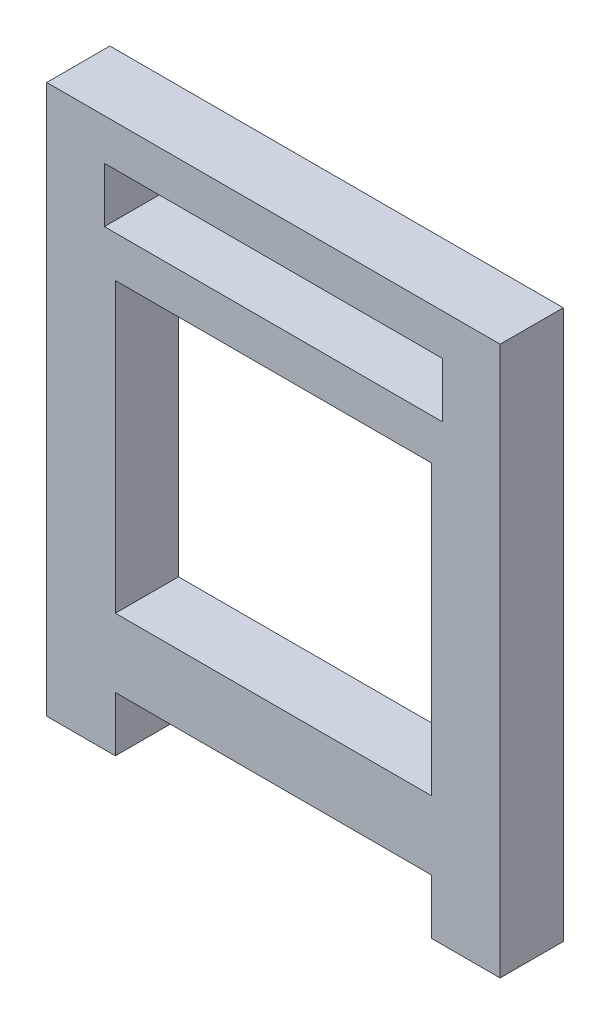
ISO-10303-21;
HEADER;
FILE_DESCRIPTION(('STEP AP214'),'2;1');
FILE_NAME('part.step','',(''),(''),'','','');
FILE_SCHEMA(('AUTOMOTIVE_DESIGN { 1 0 10303 214 1 1 1 1 }'));
ENDSEC;
DATA;
#1=APPLICATION_CONTEXT('core data for automotive mechanical design processes');
#2=APPLICATION_PROTOCOL_DEFINITION('international standard','automotive_design',2000,#1);
#3=PRODUCT_CONTEXT('',#1,'mechanical');
#4=PRODUCT('Part','Part','',(#3));
#5=PRODUCT_RELATED_PRODUCT_CATEGORY('part','',(#4));
#6=PRODUCT_DEFINITION_FORMATION('','',#4);
#7=PRODUCT_DEFINITION_CONTEXT('part definition',#1,'design');
#8=PRODUCT_DEFINITION('design','',#6,#7);
#9=PRODUCT_DEFINITION_SHAPE('','',#8);
#10=(LENGTH_UNIT() NAMED_UNIT(*) SI_UNIT(.MILLI.,.METRE.));
#11=(NAMED_UNIT(*) PLANE_ANGLE_UNIT() SI_UNIT($,.RADIAN.));
#12=(NAMED_UNIT(*) SI_UNIT($,.STERADIAN.) SOLID_ANGLE_UNIT());
#13=UNCERTAINTY_MEASURE_WITH_UNIT(LENGTH_MEASURE(1.E-05),#10,'distance_accuracy_value','');
#14=(GEOMETRIC_REPRESENTATION_CONTEXT(3) GLOBAL_UNCERTAINTY_ASSIGNED_CONTEXT((#13)) GLOBAL_UNIT_ASSIGNED_CONTEXT((#10,
#11,#12)) REPRESENTATION_CONTEXT('',''));
#15=CARTESIAN_POINT('',(0.,0.,0.));
#16=DIRECTION('',(0.,0.,1.));
#17=DIRECTION('',(1.,0.,0.));
#18=AXIS2_PLACEMENT_3D('',#15,#16,#17);
#19=CARTESIAN_POINT('',(0.,0.,2.3));
#20=DIRECTION('',(0.,0.,-1.));
#21=DIRECTION('',(-1.,0.,0.));
#22=AXIS2_PLACEMENT_3D('',#19,#20,#21);
#23=PLANE('',#22);
#24=DIRECTION('',(0.,1.,0.));
#25=VECTOR('',#24,1.);
#26=CARTESIAN_POINT('',(14.02,2.5,2.3));
#27=LINE('',#26,#25);
#28=CARTESIAN_POINT('',(14.02,2.5,2.3));
#29=VERTEX_POINT('',#28);
#30=CARTESIAN_POINT('',(14.02,13.,2.3));
#31=VERTEX_POINT('',#30);
#32=EDGE_CURVE('E188',#29,#31,#27,.T.);
#33=ORIENTED_EDGE('',*,*,#32,.F.);
#34=DIRECTION('',(1.,0.,0.));
#35=VECTOR('',#34,1.);
#36=CARTESIAN_POINT('',(2.5,2.5,2.3));
#37=LINE('',#36,#35);
#38=CARTESIAN_POINT('',(2.5,2.5,2.3));
#39=VERTEX_POINT('',#38);
#40=EDGE_CURVE('E196',#39,#29,#37,.T.);
#41=ORIENTED_EDGE('',*,*,#40,.F.);
#42=DIRECTION('',(0.,-1.,0.));
#43=VECTOR('',#42,1.);
#44=CARTESIAN_POINT('',(2.5,2.5,2.3));
#45=LINE('',#44,#43);
#46=CARTESIAN_POINT('',(2.5,13.,2.3));
#47=VERTEX_POINT('',#46);
#48=EDGE_CURVE('E193',#47,#39,#45,.T.);
#49=ORIENTED_EDGE('',*,*,#48,.F.);
#50=DIRECTION('',(-1.,0.,0.));
#51=VECTOR('',#50,1.);
#52=CARTESIAN_POINT('',(2.5,13.,2.3));
#53=LINE('',#52,#51);
#54=EDGE_CURVE('E190',#31,#47,#53,.T.);
#55=ORIENTED_EDGE('',*,*,#54,.F.);
#56=EDGE_LOOP('',(#33,#41,#49,#55));
#57=FACE_BOUND('',#56,.T.);
#58=DIRECTION('',(0.,-1.,0.));
#59=VECTOR('',#58,1.);
#60=CARTESIAN_POINT('',(0.,0.,2.3));
#61=LINE('',#60,#59);
#62=CARTESIAN_POINT('',(0.,18.,2.3));
#63=VERTEX_POINT('',#62);
#64=CARTESIAN_POINT('',(0.,-2.,2.3));
#65=VERTEX_POINT('',#64);
#66=EDGE_CURVE('E219',#63,#65,#61,.T.);
#67=ORIENTED_EDGE('',*,*,#66,.T.);
#68=DIRECTION('',(1.,0.,0.));
#69=VECTOR('',#68,1.);
#70=CARTESIAN_POINT('',(0.,-2.,2.3));
#71=LINE('',#70,#69);
#72=CARTESIAN_POINT('',(2.5,-2.,2.3));
#73=VERTEX_POINT('',#72);
#74=EDGE_CURVE('E221',#65,#73,#71,.T.);
#75=ORIENTED_EDGE('',*,*,#74,.T.);
#76=DIRECTION('',(0.,1.,0.));
#77=VECTOR('',#76,1.);
#78=CARTESIAN_POINT('',(2.5,-2.,2.3));
#79=LINE('',#78,#77);
#80=CARTESIAN_POINT('',(2.5,0.,2.3));
#81=VERTEX_POINT('',#80);
#82=EDGE_CURVE('E224',#73,#81,#79,.T.);
#83=ORIENTED_EDGE('',*,*,#82,.T.);
#84=DIRECTION('',(1.,0.,0.));
#85=VECTOR('',#84,1.);
#86=CARTESIAN_POINT('',(2.5,0.,2.3));
#87=LINE('',#86,#85);
#88=CARTESIAN_POINT('',(14.02,0.,2.3));
#89=VERTEX_POINT('',#88);
#90=EDGE_CURVE('E226',#81,#89,#87,.T.);
#91=ORIENTED_EDGE('',*,*,#90,.T.);
#92=DIRECTION('',(0.,-1.,0.));
#93=VECTOR('',#92,1.);
#94=CARTESIAN_POINT('',(14.02,-2.,2.3));
#95=LINE('',#94,#93);
#96=CARTESIAN_POINT('',(14.02,-2.,2.3));
#97=VERTEX_POINT('',#96);
#98=EDGE_CURVE('E228',#89,#97,#95,.T.);
#99=ORIENTED_EDGE('',*,*,#98,.T.);
#100=DIRECTION('',(1.,0.,0.));
#101=VECTOR('',#100,1.);
#102=CARTESIAN_POINT('',(16.52,-2.,2.3));
#103=LINE('',#102,#101);
#104=CARTESIAN_POINT('',(16.52,-2.,2.3));
#105=VERTEX_POINT('',#104);
#106=EDGE_CURVE('E230',#97,#105,#103,.T.);
#107=ORIENTED_EDGE('',*,*,#106,.T.);
#108=DIRECTION('',(0.,1.,0.));
#109=VECTOR('',#108,1.);
#110=CARTESIAN_POINT('',(16.52,0.,2.3));
#111=LINE('',#110,#109);
#112=CARTESIAN_POINT('',(16.52,18.,2.3));
#113=VERTEX_POINT('',#112);
#114=EDGE_CURVE('E232',#105,#113,#111,.T.);
#115=ORIENTED_EDGE('',*,*,#114,.T.);
#116=DIRECTION('',(-1.,0.,0.));
#117=VECTOR('',#116,1.);
#118=CARTESIAN_POINT('',(0.,18.,2.3));
#119=LINE('',#118,#117);
#120=EDGE_CURVE('E234',#113,#63,#119,.T.);
#121=ORIENTED_EDGE('',*,*,#120,.T.);
#122=EDGE_LOOP('',(#67,#75,#83,#91,#99,#107,#115,#121));
#123=FACE_BOUND('',#122,.T.);
#124=DIRECTION('',(0.,-1.,0.));
#125=VECTOR('',#124,1.);
#126=CARTESIAN_POINT('',(2.1,14.5,2.3));
#127=LINE('',#126,#125);
#128=CARTESIAN_POINT('',(2.1,16.5,2.3));
#129=VERTEX_POINT('',#128);
#130=CARTESIAN_POINT('',(2.1,14.5,2.3));
#131=VERTEX_POINT('',#130);
#132=EDGE_CURVE('E152',#129,#131,#127,.T.);
#133=ORIENTED_EDGE('',*,*,#132,.F.);
#134=DIRECTION('',(-1.,0.,0.));
#135=VECTOR('',#134,1.);
#136=CARTESIAN_POINT('',(2.1,16.5,2.3));
#137=LINE('',#136,#135);
#138=CARTESIAN_POINT('',(14.42,16.5,2.3));
#139=VERTEX_POINT('',#138);
#140=EDGE_CURVE('E174',#139,#129,#137,.T.);
#141=ORIENTED_EDGE('',*,*,#140,.F.);
#142=DIRECTION('',(0.,1.,0.));
#143=VECTOR('',#142,1.);
#144=CARTESIAN_POINT('',(14.42,14.5,2.3));
#145=LINE('',#144,#143);
#146=CARTESIAN_POINT('',(14.42,14.5,2.3));
#147=VERTEX_POINT('',#146);
#148=EDGE_CURVE('E172',#147,#139,#145,.T.);
#149=ORIENTED_EDGE('',*,*,#148,.F.);
#150=DIRECTION('',(1.,0.,0.));
#151=VECTOR('',#150,1.);
#152=CARTESIAN_POINT('',(2.1,14.5,2.3));
#153=LINE('',#152,#151);
#154=EDGE_CURVE('E160',#131,#147,#153,.T.);
#155=ORIENTED_EDGE('',*,*,#154,.F.);
#156=EDGE_LOOP('',(#133,#141,#149,#155));
#157=FACE_BOUND('',#156,.T.);
#158=ADVANCED_FACE('F39',(#57,#123,#157),#23,.F.);
#159=CARTESIAN_POINT('',(0.,0.,0.));
#160=DIRECTION('',(0.,0.,-1.));
#161=DIRECTION('',(-1.,0.,0.));
#162=AXIS2_PLACEMENT_3D('',#159,#160,#161);
#163=PLANE('',#162);
#164=DIRECTION('',(0.,-1.,0.));
#165=VECTOR('',#164,1.);
#166=CARTESIAN_POINT('',(0.,0.,0.));
#167=LINE('',#166,#165);
#168=CARTESIAN_POINT('',(0.,18.,0.));
#169=VERTEX_POINT('',#168);
#170=CARTESIAN_POINT('',(0.,-2.,0.));
#171=VERTEX_POINT('',#170);
#172=EDGE_CURVE('E218',#169,#171,#167,.T.);
#173=ORIENTED_EDGE('',*,*,#172,.F.);
#174=DIRECTION('',(-1.,0.,0.));
#175=VECTOR('',#174,1.);
#176=CARTESIAN_POINT('',(0.,18.,0.));
#177=LINE('',#176,#175);
#178=CARTESIAN_POINT('',(16.52,18.,0.));
#179=VERTEX_POINT('',#178);
#180=EDGE_CURVE('E222',#179,#169,#177,.T.);
#181=ORIENTED_EDGE('',*,*,#180,.F.);
#182=DIRECTION('',(0.,1.,0.));
#183=VECTOR('',#182,1.);
#184=CARTESIAN_POINT('',(16.52,0.,0.));
#185=LINE('',#184,#183);
#186=CARTESIAN_POINT('',(16.52,-2.,0.));
#187=VERTEX_POINT('',#186);
#188=EDGE_CURVE('E249',#187,#179,#185,.T.);
#189=ORIENTED_EDGE('',*,*,#188,.F.);
#190=DIRECTION('',(1.,0.,0.));
#191=VECTOR('',#190,1.);
#192=CARTESIAN_POINT('',(16.52,-2.,0.));
#193=LINE('',#192,#191);
#194=CARTESIAN_POINT('',(14.02,-2.,0.));
#195=VERTEX_POINT('',#194);
#196=EDGE_CURVE('E246',#195,#187,#193,.T.);
#197=ORIENTED_EDGE('',*,*,#196,.F.);
#198=DIRECTION('',(0.,-1.,0.));
#199=VECTOR('',#198,1.);
#200=CARTESIAN_POINT('',(14.02,-2.,0.));
#201=LINE('',#200,#199);
#202=CARTESIAN_POINT('',(14.02,0.,0.));
#203=VERTEX_POINT('',#202);
#204=EDGE_CURVE('E244',#203,#195,#201,.T.);
#205=ORIENTED_EDGE('',*,*,#204,.F.);
#206=DIRECTION('',(1.,0.,0.));
#207=VECTOR('',#206,1.);
#208=CARTESIAN_POINT('',(2.5,0.,0.));
#209=LINE('',#208,#207);
#210=CARTESIAN_POINT('',(2.5,0.,0.));
#211=VERTEX_POINT('',#210);
#212=EDGE_CURVE('E242',#211,#203,#209,.T.);
#213=ORIENTED_EDGE('',*,*,#212,.F.);
#214=DIRECTION('',(0.,1.,0.));
#215=VECTOR('',#214,1.);
#216=CARTESIAN_POINT('',(2.5,-2.,0.));
#217=LINE('',#216,#215);
#218=CARTESIAN_POINT('',(2.5,-2.,0.));
#219=VERTEX_POINT('',#218);
#220=EDGE_CURVE('E240',#219,#211,#217,.T.);
#221=ORIENTED_EDGE('',*,*,#220,.F.);
#222=DIRECTION('',(1.,0.,0.));
#223=VECTOR('',#222,1.);
#224=CARTESIAN_POINT('',(0.,-2.,0.));
#225=LINE('',#224,#223);
#226=EDGE_CURVE('E238',#171,#219,#225,.T.);
#227=ORIENTED_EDGE('',*,*,#226,.F.);
#228=EDGE_LOOP('',(#173,#181,#189,#197,#205,#213,#221,#227));
#229=FACE_BOUND('',#228,.T.);
#230=DIRECTION('',(1.,0.,0.));
#231=VECTOR('',#230,1.);
#232=CARTESIAN_POINT('',(2.5,2.5,0.));
#233=LINE('',#232,#231);
#234=CARTESIAN_POINT('',(2.5,2.5,0.));
#235=VERTEX_POINT('',#234);
#236=CARTESIAN_POINT('',(14.02,2.5,0.));
#237=VERTEX_POINT('',#236);
#238=EDGE_CURVE('E191',#235,#237,#233,.T.);
#239=ORIENTED_EDGE('',*,*,#238,.T.);
#240=DIRECTION('',(0.,1.,0.));
#241=VECTOR('',#240,1.);
#242=CARTESIAN_POINT('',(14.02,2.5,0.));
#243=LINE('',#242,#241);
#244=CARTESIAN_POINT('',(14.02,13.,0.));
#245=VERTEX_POINT('',#244);
#246=EDGE_CURVE('E168',#237,#245,#243,.T.);
#247=ORIENTED_EDGE('',*,*,#246,.T.);
#248=DIRECTION('',(-1.,0.,0.));
#249=VECTOR('',#248,1.);
#250=CARTESIAN_POINT('',(2.5,13.,0.));
#251=LINE('',#250,#249);
#252=CARTESIAN_POINT('',(2.5,13.,0.));
#253=VERTEX_POINT('',#252);
#254=EDGE_CURVE('E201',#245,#253,#251,.T.);
#255=ORIENTED_EDGE('',*,*,#254,.T.);
#256=DIRECTION('',(0.,-1.,0.));
#257=VECTOR('',#256,1.);
#258=CARTESIAN_POINT('',(2.5,2.5,0.));
#259=LINE('',#258,#257);
#260=EDGE_CURVE('E204',#253,#235,#259,.T.);
#261=ORIENTED_EDGE('',*,*,#260,.T.);
#262=EDGE_LOOP('',(#239,#247,#255,#261));
#263=FACE_BOUND('',#262,.T.);
#264=DIRECTION('',(-1.,0.,0.));
#265=VECTOR('',#264,1.);
#266=CARTESIAN_POINT('',(2.1,16.5,0.));
#267=LINE('',#266,#265);
#268=CARTESIAN_POINT('',(14.42,16.5,0.));
#269=VERTEX_POINT('',#268);
#270=CARTESIAN_POINT('',(2.1,16.5,0.));
#271=VERTEX_POINT('',#270);
#272=EDGE_CURVE('E161',#269,#271,#267,.T.);
#273=ORIENTED_EDGE('',*,*,#272,.T.);
#274=DIRECTION('',(0.,-1.,0.));
#275=VECTOR('',#274,1.);
#276=CARTESIAN_POINT('',(2.1,14.5,0.));
#277=LINE('',#276,#275);
#278=CARTESIAN_POINT('',(2.1,14.5,0.));
#279=VERTEX_POINT('',#278);
#280=EDGE_CURVE('E62',#271,#279,#277,.T.);
#281=ORIENTED_EDGE('',*,*,#280,.T.);
#282=DIRECTION('',(1.,0.,0.));
#283=VECTOR('',#282,1.);
#284=CARTESIAN_POINT('',(2.1,14.5,0.));
#285=LINE('',#284,#283);
#286=CARTESIAN_POINT('',(14.42,14.5,0.));
#287=VERTEX_POINT('',#286);
#288=EDGE_CURVE('E167',#279,#287,#285,.T.);
#289=ORIENTED_EDGE('',*,*,#288,.T.);
#290=DIRECTION('',(0.,1.,0.));
#291=VECTOR('',#290,1.);
#292=CARTESIAN_POINT('',(14.42,14.5,0.));
#293=LINE('',#292,#291);
#294=EDGE_CURVE('E180',#287,#269,#293,.T.);
#295=ORIENTED_EDGE('',*,*,#294,.T.);
#296=EDGE_LOOP('',(#273,#281,#289,#295));
#297=FACE_BOUND('',#296,.T.);
#298=ADVANCED_FACE('F281',(#229,#263,#297),#163,.T.);
#299=CARTESIAN_POINT('',(0.,0.,2.3));
#300=DIRECTION('',(1.,0.,0.));
#301=DIRECTION('',(0.,1.,0.));
#302=AXIS2_PLACEMENT_3D('',#299,#300,#301);
#303=PLANE('',#302);
#304=ORIENTED_EDGE('',*,*,#172,.T.);
#305=DIRECTION('',(0.,0.,-1.));
#306=VECTOR('',#305,1.);
#307=CARTESIAN_POINT('',(0.,-2.,2.3));
#308=LINE('',#307,#306);
#309=EDGE_CURVE('E11',#65,#171,#308,.T.);
#310=ORIENTED_EDGE('',*,*,#309,.F.);
#311=ORIENTED_EDGE('',*,*,#66,.F.);
#312=DIRECTION('',(0.,0.,-1.));
#313=VECTOR('',#312,1.);
#314=CARTESIAN_POINT('',(0.,18.,2.3));
#315=LINE('',#314,#313);
#316=EDGE_CURVE('E236',#63,#169,#315,.T.);
#317=ORIENTED_EDGE('',*,*,#316,.T.);
#318=EDGE_LOOP('',(#304,#310,#311,#317));
#319=FACE_BOUND('',#318,.T.);
#320=ADVANCED_FACE('F41',(#319),#303,.F.);
#321=CARTESIAN_POINT('',(0.,-2.,2.3));
#322=DIRECTION('',(0.,1.,0.));
#323=DIRECTION('',(0.,0.,1.));
#324=AXIS2_PLACEMENT_3D('',#321,#322,#323);
#325=PLANE('',#324);
#326=ORIENTED_EDGE('',*,*,#226,.T.);
#327=DIRECTION('',(0.,0.,-1.));
#328=VECTOR('',#327,1.);
#329=CARTESIAN_POINT('',(2.5,-2.,2.3));
#330=LINE('',#329,#328);
#331=EDGE_CURVE('E47',#73,#219,#330,.T.);
#332=ORIENTED_EDGE('',*,*,#331,.F.);
#333=ORIENTED_EDGE('',*,*,#74,.F.);
#334=ORIENTED_EDGE('',*,*,#309,.T.);
#335=EDGE_LOOP('',(#326,#332,#333,#334));
#336=FACE_BOUND('',#335,.T.);
#337=ADVANCED_FACE('F298',(#336),#325,.F.);
#338=CARTESIAN_POINT('',(2.5,-2.,2.3));
#339=DIRECTION('',(-1.,0.,0.));
#340=DIRECTION('',(0.,0.,1.));
#341=AXIS2_PLACEMENT_3D('',#338,#339,#340);
#342=PLANE('',#341);
#343=ORIENTED_EDGE('',*,*,#220,.T.);
#344=DIRECTION('',(0.,0.,-1.));
#345=VECTOR('',#344,1.);
#346=CARTESIAN_POINT('',(2.5,0.,2.3));
#347=LINE('',#346,#345);
#348=EDGE_CURVE('E267',#81,#211,#347,.T.);
#349=ORIENTED_EDGE('',*,*,#348,.F.);
#350=ORIENTED_EDGE('',*,*,#82,.F.);
#351=ORIENTED_EDGE('',*,*,#331,.T.);
#352=EDGE_LOOP('',(#343,#349,#350,#351));
#353=FACE_BOUND('',#352,.T.);
#354=ADVANCED_FACE('F274',(#353),#342,.F.);
#355=CARTESIAN_POINT('',(2.5,0.,2.3));
#356=DIRECTION('',(0.,1.,0.));
#357=DIRECTION('',(0.,0.,1.));
#358=AXIS2_PLACEMENT_3D('',#355,#356,#357);
#359=PLANE('',#358);
#360=ORIENTED_EDGE('',*,*,#212,.T.);
#361=DIRECTION('',(0.,0.,-1.));
#362=VECTOR('',#361,1.);
#363=CARTESIAN_POINT('',(14.02,0.,2.3));
#364=LINE('',#363,#362);
#365=EDGE_CURVE('E264',#89,#203,#364,.T.);
#366=ORIENTED_EDGE('',*,*,#365,.F.);
#367=ORIENTED_EDGE('',*,*,#90,.F.);
#368=ORIENTED_EDGE('',*,*,#348,.T.);
#369=EDGE_LOOP('',(#360,#366,#367,#368));
#370=FACE_BOUND('',#369,.T.);
#371=ADVANCED_FACE('F287',(#370),#359,.F.);
#372=CARTESIAN_POINT('',(14.02,-2.,2.3));
#373=DIRECTION('',(1.,0.,0.));
#374=DIRECTION('',(0.,0.,-1.));
#375=AXIS2_PLACEMENT_3D('',#372,#373,#374);
#376=PLANE('',#375);
#377=ORIENTED_EDGE('',*,*,#204,.T.);
#378=DIRECTION('',(0.,0.,-1.));
#379=VECTOR('',#378,1.);
#380=CARTESIAN_POINT('',(14.02,-2.,2.3));
#381=LINE('',#380,#379);
#382=EDGE_CURVE('E261',#97,#195,#381,.T.);
#383=ORIENTED_EDGE('',*,*,#382,.F.);
#384=ORIENTED_EDGE('',*,*,#98,.F.);
#385=ORIENTED_EDGE('',*,*,#365,.T.);
#386=EDGE_LOOP('',(#377,#383,#384,#385));
#387=FACE_BOUND('',#386,.T.);
#388=ADVANCED_FACE('F291',(#387),#376,.F.);
#389=CARTESIAN_POINT('',(16.52,-2.,2.3));
#390=DIRECTION('',(0.,1.,0.));
#391=DIRECTION('',(-1.,0.,0.));
#392=AXIS2_PLACEMENT_3D('',#389,#390,#391);
#393=PLANE('',#392);
#394=ORIENTED_EDGE('',*,*,#196,.T.);
#395=DIRECTION('',(0.,0.,-1.));
#396=VECTOR('',#395,1.);
#397=CARTESIAN_POINT('',(16.52,-2.,2.3));
#398=LINE('',#397,#396);
#399=EDGE_CURVE('E258',#105,#187,#398,.T.);
#400=ORIENTED_EDGE('',*,*,#399,.F.);
#401=ORIENTED_EDGE('',*,*,#106,.F.);
#402=ORIENTED_EDGE('',*,*,#382,.T.);
#403=EDGE_LOOP('',(#394,#400,#401,#402));
#404=FACE_BOUND('',#403,.T.);
#405=ADVANCED_FACE('F310',(#404),#393,.F.);
#406=CARTESIAN_POINT('',(16.52,0.,2.3));
#407=DIRECTION('',(-1.,0.,0.));
#408=DIRECTION('',(0.,0.,1.));
#409=AXIS2_PLACEMENT_3D('',#406,#407,#408);
#410=PLANE('',#409);
#411=ORIENTED_EDGE('',*,*,#188,.T.);
#412=DIRECTION('',(0.,0.,-1.));
#413=VECTOR('',#412,1.);
#414=CARTESIAN_POINT('',(16.52,18.,2.3));
#415=LINE('',#414,#413);
#416=EDGE_CURVE('E255',#113,#179,#415,.T.);
#417=ORIENTED_EDGE('',*,*,#416,.F.);
#418=ORIENTED_EDGE('',*,*,#114,.F.);
#419=ORIENTED_EDGE('',*,*,#399,.T.);
#420=EDGE_LOOP('',(#411,#417,#418,#419));
#421=FACE_BOUND('',#420,.T.);
#422=ADVANCED_FACE('F308',(#421),#410,.F.);
#423=CARTESIAN_POINT('',(0.,18.,2.3));
#424=DIRECTION('',(0.,-1.,0.));
#425=DIRECTION('',(0.,0.,-1.));
#426=AXIS2_PLACEMENT_3D('',#423,#424,#425);
#427=PLANE('',#426);
#428=ORIENTED_EDGE('',*,*,#180,.T.);
#429=ORIENTED_EDGE('',*,*,#316,.F.);
#430=ORIENTED_EDGE('',*,*,#120,.F.);
#431=ORIENTED_EDGE('',*,*,#416,.T.);
#432=EDGE_LOOP('',(#428,#429,#430,#431));
#433=FACE_BOUND('',#432,.T.);
#434=ADVANCED_FACE('F303',(#433),#427,.F.);
#435=CARTESIAN_POINT('',(14.02,2.5,2.3));
#436=DIRECTION('',(-1.,0.,0.));
#437=DIRECTION('',(0.,0.,1.));
#438=AXIS2_PLACEMENT_3D('',#435,#436,#437);
#439=PLANE('',#438);
#440=ORIENTED_EDGE('',*,*,#246,.F.);
#441=DIRECTION('',(0.,0.,-1.));
#442=VECTOR('',#441,1.);
#443=CARTESIAN_POINT('',(14.02,2.5,2.3));
#444=LINE('',#443,#442);
#445=EDGE_CURVE('E198',#29,#237,#444,.T.);
#446=ORIENTED_EDGE('',*,*,#445,.F.);
#447=ORIENTED_EDGE('',*,*,#32,.T.);
#448=DIRECTION('',(0.,0.,-1.));
#449=VECTOR('',#448,1.);
#450=CARTESIAN_POINT('',(14.02,13.,2.3));
#451=LINE('',#450,#449);
#452=EDGE_CURVE('E215',#31,#245,#451,.T.);
#453=ORIENTED_EDGE('',*,*,#452,.T.);
#454=EDGE_LOOP('',(#440,#446,#447,#453));
#455=FACE_BOUND('',#454,.T.);
#456=ADVANCED_FACE('F328',(#455),#439,.T.);
#457=CARTESIAN_POINT('',(2.5,13.,2.3));
#458=DIRECTION('',(0.,-1.,0.));
#459=DIRECTION('',(0.,0.,-1.));
#460=AXIS2_PLACEMENT_3D('',#457,#458,#459);
#461=PLANE('',#460);
#462=ORIENTED_EDGE('',*,*,#254,.F.);
#463=ORIENTED_EDGE('',*,*,#452,.F.);
#464=ORIENTED_EDGE('',*,*,#54,.T.);
#465=DIRECTION('',(0.,0.,-1.));
#466=VECTOR('',#465,1.);
#467=CARTESIAN_POINT('',(2.5,13.,2.3));
#468=LINE('',#467,#466);
#469=EDGE_CURVE('E213',#47,#253,#468,.T.);
#470=ORIENTED_EDGE('',*,*,#469,.T.);
#471=EDGE_LOOP('',(#462,#463,#464,#470));
#472=FACE_BOUND('',#471,.T.);
#473=ADVANCED_FACE('F335',(#472),#461,.T.);
#474=CARTESIAN_POINT('',(2.5,2.5,2.3));
#475=DIRECTION('',(1.,0.,0.));
#476=DIRECTION('',(0.,0.,-1.));
#477=AXIS2_PLACEMENT_3D('',#474,#475,#476);
#478=PLANE('',#477);
#479=ORIENTED_EDGE('',*,*,#260,.F.);
#480=ORIENTED_EDGE('',*,*,#469,.F.);
#481=ORIENTED_EDGE('',*,*,#48,.T.);
#482=DIRECTION('',(0.,0.,-1.));
#483=VECTOR('',#482,1.);
#484=CARTESIAN_POINT('',(2.5,2.5,2.3));
#485=LINE('',#484,#483);
#486=EDGE_CURVE('E211',#39,#235,#485,.T.);
#487=ORIENTED_EDGE('',*,*,#486,.T.);
#488=EDGE_LOOP('',(#479,#480,#481,#487));
#489=FACE_BOUND('',#488,.T.);
#490=ADVANCED_FACE('F340',(#489),#478,.T.);
#491=CARTESIAN_POINT('',(2.5,2.5,2.3));
#492=DIRECTION('',(0.,1.,0.));
#493=DIRECTION('',(0.,0.,1.));
#494=AXIS2_PLACEMENT_3D('',#491,#492,#493);
#495=PLANE('',#494);
#496=ORIENTED_EDGE('',*,*,#238,.F.);
#497=ORIENTED_EDGE('',*,*,#486,.F.);
#498=ORIENTED_EDGE('',*,*,#40,.T.);
#499=ORIENTED_EDGE('',*,*,#445,.T.);
#500=EDGE_LOOP('',(#496,#497,#498,#499));
#501=FACE_BOUND('',#500,.T.);
#502=ADVANCED_FACE('F346',(#501),#495,.T.);
#503=CARTESIAN_POINT('',(2.1,14.5,2.3));
#504=DIRECTION('',(1.,0.,0.));
#505=DIRECTION('',(0.,0.,-1.));
#506=AXIS2_PLACEMENT_3D('',#503,#504,#505);
#507=PLANE('',#506);
#508=ORIENTED_EDGE('',*,*,#280,.F.);
#509=DIRECTION('',(0.,0.,-1.));
#510=VECTOR('',#509,1.);
#511=CARTESIAN_POINT('',(2.1,16.5,2.3));
#512=LINE('',#511,#510);
#513=EDGE_CURVE('E156',#129,#271,#512,.T.);
#514=ORIENTED_EDGE('',*,*,#513,.F.);
#515=ORIENTED_EDGE('',*,*,#132,.T.);
#516=DIRECTION('',(0.,0.,-1.));
#517=VECTOR('',#516,1.);
#518=CARTESIAN_POINT('',(2.1,14.5,2.3));
#519=LINE('',#518,#517);
#520=EDGE_CURVE('E155',#131,#279,#519,.T.);
#521=ORIENTED_EDGE('',*,*,#520,.T.);
#522=EDGE_LOOP('',(#508,#514,#515,#521));
#523=FACE_BOUND('',#522,.T.);
#524=ADVANCED_FACE('F154',(#523),#507,.T.);
#525=CARTESIAN_POINT('',(2.1,14.5,2.3));
#526=DIRECTION('',(0.,1.,0.));
#527=DIRECTION('',(0.,0.,1.));
#528=AXIS2_PLACEMENT_3D('',#525,#526,#527);
#529=PLANE('',#528);
#530=ORIENTED_EDGE('',*,*,#288,.F.);
#531=ORIENTED_EDGE('',*,*,#520,.F.);
#532=ORIENTED_EDGE('',*,*,#154,.T.);
#533=DIRECTION('',(0.,0.,-1.));
#534=VECTOR('',#533,1.);
#535=CARTESIAN_POINT('',(14.42,14.5,2.3));
#536=LINE('',#535,#534);
#537=EDGE_CURVE('E169',#147,#287,#536,.T.);
#538=ORIENTED_EDGE('',*,*,#537,.T.);
#539=EDGE_LOOP('',(#530,#531,#532,#538));
#540=FACE_BOUND('',#539,.T.);
#541=ADVANCED_FACE('F164',(#540),#529,.T.);
#542=CARTESIAN_POINT('',(14.42,14.5,2.3));
#543=DIRECTION('',(-1.,0.,0.));
#544=DIRECTION('',(0.,0.,1.));
#545=AXIS2_PLACEMENT_3D('',#542,#543,#544);
#546=PLANE('',#545);
#547=ORIENTED_EDGE('',*,*,#294,.F.);
#548=ORIENTED_EDGE('',*,*,#537,.F.);
#549=ORIENTED_EDGE('',*,*,#148,.T.);
#550=DIRECTION('',(0.,0.,-1.));
#551=VECTOR('',#550,1.);
#552=CARTESIAN_POINT('',(14.42,16.5,2.3));
#553=LINE('',#552,#551);
#554=EDGE_CURVE('E54',#139,#269,#553,.T.);
#555=ORIENTED_EDGE('',*,*,#554,.T.);
#556=EDGE_LOOP('',(#547,#548,#549,#555));
#557=FACE_BOUND('',#556,.T.);
#558=ADVANCED_FACE('F365',(#557),#546,.T.);
#559=CARTESIAN_POINT('',(2.1,16.5,2.3));
#560=DIRECTION('',(0.,-1.,0.));
#561=DIRECTION('',(0.,0.,-1.));
#562=AXIS2_PLACEMENT_3D('',#559,#560,#561);
#563=PLANE('',#562);
#564=ORIENTED_EDGE('',*,*,#272,.F.);
#565=ORIENTED_EDGE('',*,*,#554,.F.);
#566=ORIENTED_EDGE('',*,*,#140,.T.);
#567=ORIENTED_EDGE('',*,*,#513,.T.);
#568=EDGE_LOOP('',(#564,#565,#566,#567));
#569=FACE_BOUND('',#568,.T.);
#570=ADVANCED_FACE('F368',(#569),#563,.T.);
#571=CLOSED_SHELL('',(#158,#298,#320,#337,#354,#371,#388,#405,#422,#434,#456,#473,#490,#502,
#524,#541,#558,#570));
#572=MANIFOLD_SOLID_BREP('B2',#571);
#573=ADVANCED_BREP_SHAPE_REPRESENTATION('',(#18,#572),#14);
#574=SHAPE_DEFINITION_REPRESENTATION(#9,#573);
ENDSEC;
END-ISO-10303-21;
